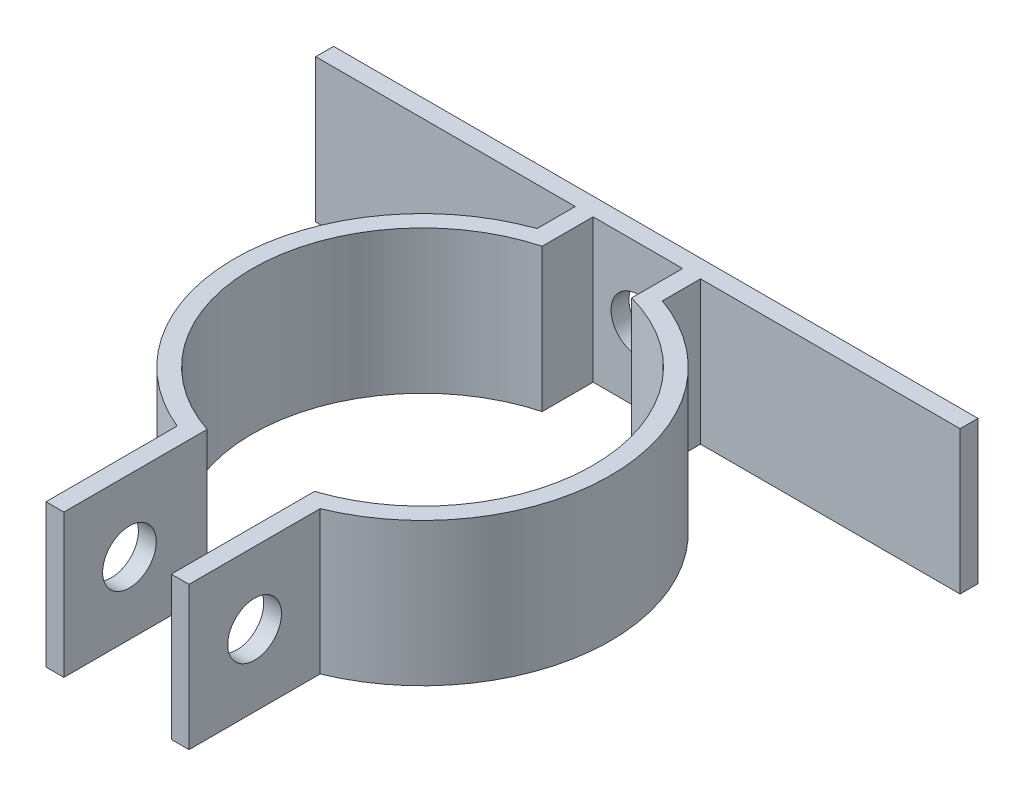
ISO-10303-21;
HEADER;
FILE_DESCRIPTION(('STEP AP214'),'2;1');
FILE_NAME('part.step','',(''),(''),'','','');
FILE_SCHEMA(('AUTOMOTIVE_DESIGN { 1 0 10303 214 1 1 1 1 }'));
ENDSEC;
DATA;
#1=APPLICATION_CONTEXT('core data for automotive mechanical design processes');
#2=APPLICATION_PROTOCOL_DEFINITION('international standard','automotive_design',2000,#1);
#3=PRODUCT_CONTEXT('',#1,'mechanical');
#4=PRODUCT('Part','Part','',(#3));
#5=PRODUCT_RELATED_PRODUCT_CATEGORY('part','',(#4));
#6=PRODUCT_DEFINITION_FORMATION('','',#4);
#7=PRODUCT_DEFINITION_CONTEXT('part definition',#1,'design');
#8=PRODUCT_DEFINITION('design','',#6,#7);
#9=PRODUCT_DEFINITION_SHAPE('','',#8);
#10=(LENGTH_UNIT() NAMED_UNIT(*) SI_UNIT(.MILLI.,.METRE.));
#11=(NAMED_UNIT(*) PLANE_ANGLE_UNIT() SI_UNIT($,.RADIAN.));
#12=(NAMED_UNIT(*) SI_UNIT($,.STERADIAN.) SOLID_ANGLE_UNIT());
#13=UNCERTAINTY_MEASURE_WITH_UNIT(LENGTH_MEASURE(1.E-05),#10,'distance_accuracy_value','');
#14=(GEOMETRIC_REPRESENTATION_CONTEXT(3) GLOBAL_UNCERTAINTY_ASSIGNED_CONTEXT((#13)) GLOBAL_UNIT_ASSIGNED_CONTEXT((#10,
#11,#12)) REPRESENTATION_CONTEXT('',''));
#15=CARTESIAN_POINT('',(0.,0.,0.));
#16=DIRECTION('',(0.,0.,1.));
#17=DIRECTION('',(1.,0.,0.));
#18=AXIS2_PLACEMENT_3D('',#15,#16,#17);
#19=CARTESIAN_POINT('',(0.,25.4,0.));
#20=DIRECTION('',(0.,0.,-1.));
#21=DIRECTION('',(-1.,0.,0.));
#22=AXIS2_PLACEMENT_3D('',#19,#20,#21);
#23=PLANE('',#22);
#24=DIRECTION('',(1.,0.,0.));
#25=VECTOR('',#24,1.);
#26=CARTESIAN_POINT('',(0.,0.,0.));
#27=LINE('',#26,#25);
#28=CARTESIAN_POINT('',(0.,0.,0.));
#29=VERTEX_POINT('',#28);
#30=CARTESIAN_POINT('',(46.0375,0.,0.));
#31=VERTEX_POINT('',#30);
#32=EDGE_CURVE('E201',#29,#31,#27,.T.);
#33=ORIENTED_EDGE('',*,*,#32,.T.);
#34=DIRECTION('',(0.,-1.,0.));
#35=VECTOR('',#34,1.);
#36=CARTESIAN_POINT('',(46.0375,25.4,0.));
#37=LINE('',#36,#35);
#38=CARTESIAN_POINT('',(46.0375,25.4,0.));
#39=VERTEX_POINT('',#38);
#40=EDGE_CURVE('E11',#39,#31,#37,.T.);
#41=ORIENTED_EDGE('',*,*,#40,.F.);
#42=DIRECTION('',(1.,0.,0.));
#43=VECTOR('',#42,1.);
#44=CARTESIAN_POINT('',(0.,25.4,0.));
#45=LINE('',#44,#43);
#46=CARTESIAN_POINT('',(0.,25.4,0.));
#47=VERTEX_POINT('',#46);
#48=EDGE_CURVE('E240',#47,#39,#45,.T.);
#49=ORIENTED_EDGE('',*,*,#48,.F.);
#50=DIRECTION('',(0.,-1.,0.));
#51=VECTOR('',#50,1.);
#52=CARTESIAN_POINT('',(0.,25.4,0.));
#53=LINE('',#52,#51);
#54=EDGE_CURVE('E197',#47,#29,#53,.T.);
#55=ORIENTED_EDGE('',*,*,#54,.T.);
#56=EDGE_LOOP('',(#33,#41,#49,#55));
#57=FACE_BOUND('',#56,.T.);
#58=ADVANCED_FACE('F33',(#57),#23,.F.);
#59=CARTESIAN_POINT('',(46.0375,25.4,6.77408824693363));
#60=DIRECTION('',(1.,0.,0.));
#61=DIRECTION('',(0.,0.,-1.));
#62=AXIS2_PLACEMENT_3D('',#59,#60,#61);
#63=PLANE('',#62);
#64=DIRECTION('',(0.,0.,1.));
#65=VECTOR('',#64,1.);
#66=CARTESIAN_POINT('',(46.0375,0.,6.77408824693363));
#67=LINE('',#66,#65);
#68=CARTESIAN_POINT('',(46.0375,0.,6.77408824693363));
#69=VERTEX_POINT('',#68);
#70=EDGE_CURVE('E204',#31,#69,#67,.T.);
#71=ORIENTED_EDGE('',*,*,#70,.T.);
#72=DIRECTION('',(0.,-1.,0.));
#73=VECTOR('',#72,1.);
#74=CARTESIAN_POINT('',(46.0375,25.4,6.77408824693363));
#75=LINE('',#74,#73);
#76=CARTESIAN_POINT('',(46.0375,25.4,6.77408824693363));
#77=VERTEX_POINT('',#76);
#78=EDGE_CURVE('E41',#77,#69,#75,.T.);
#79=ORIENTED_EDGE('',*,*,#78,.F.);
#80=DIRECTION('',(0.,0.,1.));
#81=VECTOR('',#80,1.);
#82=CARTESIAN_POINT('',(46.0375,25.4,6.77408824693363));
#83=LINE('',#82,#81);
#84=EDGE_CURVE('E128',#39,#77,#83,.T.);
#85=ORIENTED_EDGE('',*,*,#84,.F.);
#86=ORIENTED_EDGE('',*,*,#40,.T.);
#87=EDGE_LOOP('',(#71,#79,#85,#86));
#88=FACE_BOUND('',#87,.T.);
#89=ADVANCED_FACE('F359',(#88),#63,.F.);
#90=CARTESIAN_POINT('',(57.15,25.4,38.2049846706757));
#91=DIRECTION('',(0.,-1.,0.));
#92=DIRECTION('',(0.,0.,-1.));
#93=AXIS2_PLACEMENT_3D('',#90,#91,#92);
#94=CYLINDRICAL_SURFACE('',#93,33.3375);
#95=CARTESIAN_POINT('',(57.15,0.,38.2049846706757));
#96=DIRECTION('',(0.,1.,0.));
#97=DIRECTION('',(0.,0.,1.));
#98=AXIS2_PLACEMENT_3D('',#95,#96,#97);
#99=CIRCLE('',#98,33.3375);
#100=CARTESIAN_POINT('',(44.45,0.,69.028659115005));
#101=VERTEX_POINT('',#100);
#102=EDGE_CURVE('E207',#69,#101,#99,.T.);
#103=ORIENTED_EDGE('',*,*,#102,.T.);
#104=DIRECTION('',(0.,-1.,0.));
#105=VECTOR('',#104,1.);
#106=CARTESIAN_POINT('',(44.45,25.4,69.028659115005));
#107=LINE('',#106,#105);
#108=CARTESIAN_POINT('',(44.45,25.4,69.028659115005));
#109=VERTEX_POINT('',#108);
#110=EDGE_CURVE('E283',#109,#101,#107,.T.);
#111=ORIENTED_EDGE('',*,*,#110,.F.);
#112=CARTESIAN_POINT('',(57.15,25.4,38.2049846706757));
#113=DIRECTION('',(0.,1.,0.));
#114=DIRECTION('',(0.,0.,1.));
#115=AXIS2_PLACEMENT_3D('',#112,#113,#114);
#116=CIRCLE('',#115,33.3375);
#117=EDGE_CURVE('E291',#77,#109,#116,.T.);
#118=ORIENTED_EDGE('',*,*,#117,.F.);
#119=ORIENTED_EDGE('',*,*,#78,.T.);
#120=EDGE_LOOP('',(#103,#111,#118,#119));
#121=FACE_BOUND('',#120,.T.);
#122=ADVANCED_FACE('F289',(#121),#94,.T.);
#123=CARTESIAN_POINT('',(44.45,25.4,69.028659115005));
#124=DIRECTION('',(1.,0.,0.));
#125=DIRECTION('',(0.,0.,-1.));
#126=AXIS2_PLACEMENT_3D('',#123,#124,#125);
#127=PLANE('',#126);
#128=CARTESIAN_POINT('',(44.45,12.7,80.6650384614262));
#129=DIRECTION('',(1.,0.,0.));
#130=DIRECTION('',(0.,0.,-1.));
#131=AXIS2_PLACEMENT_3D('',#128,#129,#130);
#132=CIRCLE('',#131,4.7625);
#133=CARTESIAN_POINT('',(44.45,12.7,75.9025384614262));
#134=VERTEX_POINT('',#133);
#135=EDGE_CURVE('E205',#134,#134,#132,.T.);
#136=ORIENTED_EDGE('',*,*,#135,.T.);
#137=EDGE_LOOP('',(#136));
#138=FACE_BOUND('',#137,.T.);
#139=DIRECTION('',(0.,0.,1.));
#140=VECTOR('',#139,1.);
#141=CARTESIAN_POINT('',(44.45,0.,69.028659115005));
#142=LINE('',#141,#140);
#143=CARTESIAN_POINT('',(44.45,0.,92.2909647131982));
#144=VERTEX_POINT('',#143);
#145=EDGE_CURVE('E209',#101,#144,#142,.T.);
#146=ORIENTED_EDGE('',*,*,#145,.T.);
#147=DIRECTION('',(0.,-1.,0.));
#148=VECTOR('',#147,1.);
#149=CARTESIAN_POINT('',(44.45,25.4,92.2909647131982));
#150=LINE('',#149,#148);
#151=CARTESIAN_POINT('',(44.45,25.4,92.2909647131982));
#152=VERTEX_POINT('',#151);
#153=EDGE_CURVE('E280',#152,#144,#150,.T.);
#154=ORIENTED_EDGE('',*,*,#153,.F.);
#155=DIRECTION('',(0.,0.,1.));
#156=VECTOR('',#155,1.);
#157=CARTESIAN_POINT('',(44.45,25.4,69.028659115005));
#158=LINE('',#157,#156);
#159=EDGE_CURVE('E309',#109,#152,#158,.T.);
#160=ORIENTED_EDGE('',*,*,#159,.F.);
#161=ORIENTED_EDGE('',*,*,#110,.T.);
#162=EDGE_LOOP('',(#146,#154,#160,#161));
#163=FACE_BOUND('',#162,.T.);
#164=ADVANCED_FACE('F300',(#138,#163),#127,.F.);
#165=CARTESIAN_POINT('',(44.45,25.4,92.2909647131982));
#166=DIRECTION('',(0.,0.,-1.));
#167=DIRECTION('',(-1.,0.,0.));
#168=AXIS2_PLACEMENT_3D('',#165,#166,#167);
#169=PLANE('',#168);
#170=DIRECTION('',(1.,0.,0.));
#171=VECTOR('',#170,1.);
#172=CARTESIAN_POINT('',(44.45,0.,92.2909647131982));
#173=LINE('',#172,#171);
#174=CARTESIAN_POINT('',(47.625,0.,92.2909647131982));
#175=VERTEX_POINT('',#174);
#176=EDGE_CURVE('E211',#144,#175,#173,.T.);
#177=ORIENTED_EDGE('',*,*,#176,.T.);
#178=DIRECTION('',(0.,-1.,0.));
#179=VECTOR('',#178,1.);
#180=CARTESIAN_POINT('',(47.625,25.4,92.2909647131982));
#181=LINE('',#180,#179);
#182=CARTESIAN_POINT('',(47.625,25.4,92.2909647131982));
#183=VERTEX_POINT('',#182);
#184=EDGE_CURVE('E277',#183,#175,#181,.T.);
#185=ORIENTED_EDGE('',*,*,#184,.F.);
#186=DIRECTION('',(1.,0.,0.));
#187=VECTOR('',#186,1.);
#188=CARTESIAN_POINT('',(44.45,25.4,92.2909647131982));
#189=LINE('',#188,#187);
#190=EDGE_CURVE('E306',#152,#183,#189,.T.);
#191=ORIENTED_EDGE('',*,*,#190,.F.);
#192=ORIENTED_EDGE('',*,*,#153,.T.);
#193=EDGE_LOOP('',(#177,#185,#191,#192));
#194=FACE_BOUND('',#193,.T.);
#195=ADVANCED_FACE('F304',(#194),#169,.F.);
#196=CARTESIAN_POINT('',(47.625,25.4,66.8909647131982));
#197=DIRECTION('',(-1.,0.,0.));
#198=DIRECTION('',(0.,0.,1.));
#199=AXIS2_PLACEMENT_3D('',#196,#197,#198);
#200=PLANE('',#199);
#201=CARTESIAN_POINT('',(47.625,12.7,80.6650384614262));
#202=DIRECTION('',(-1.,0.,0.));
#203=DIRECTION('',(0.,0.,1.));
#204=AXIS2_PLACEMENT_3D('',#201,#202,#203);
#205=CIRCLE('',#204,4.7625);
#206=CARTESIAN_POINT('',(47.625,12.7,85.4275384614262));
#207=VERTEX_POINT('',#206);
#208=EDGE_CURVE('E581',#207,#207,#205,.T.);
#209=ORIENTED_EDGE('',*,*,#208,.T.);
#210=EDGE_LOOP('',(#209));
#211=FACE_BOUND('',#210,.T.);
#212=DIRECTION('',(0.,0.,-1.));
#213=VECTOR('',#212,1.);
#214=CARTESIAN_POINT('',(47.625,0.,66.8909647131982));
#215=LINE('',#214,#213);
#216=CARTESIAN_POINT('',(47.625,0.,66.8909647131982));
#217=VERTEX_POINT('',#216);
#218=EDGE_CURVE('E213',#175,#217,#215,.T.);
#219=ORIENTED_EDGE('',*,*,#218,.T.);
#220=DIRECTION('',(0.,-1.,0.));
#221=VECTOR('',#220,1.);
#222=CARTESIAN_POINT('',(47.625,25.4,66.8909647131982));
#223=LINE('',#222,#221);
#224=CARTESIAN_POINT('',(47.625,25.4,66.8909647131982));
#225=VERTEX_POINT('',#224);
#226=EDGE_CURVE('E274',#225,#217,#223,.T.);
#227=ORIENTED_EDGE('',*,*,#226,.F.);
#228=DIRECTION('',(0.,0.,-1.));
#229=VECTOR('',#228,1.);
#230=CARTESIAN_POINT('',(47.625,25.4,66.8909647131982));
#231=LINE('',#230,#229);
#232=EDGE_CURVE('E308',#183,#225,#231,.T.);
#233=ORIENTED_EDGE('',*,*,#232,.F.);
#234=ORIENTED_EDGE('',*,*,#184,.T.);
#235=EDGE_LOOP('',(#219,#227,#233,#234));
#236=FACE_BOUND('',#235,.T.);
#237=ADVANCED_FACE('F373',(#211,#236),#200,.F.);
#238=CARTESIAN_POINT('',(57.15,25.4,38.2049846706757));
#239=DIRECTION('',(0.,-1.,0.));
#240=DIRECTION('',(0.,0.,-1.));
#241=AXIS2_PLACEMENT_3D('',#238,#239,#240);
#242=CYLINDRICAL_SURFACE('',#241,30.226);
#243=CARTESIAN_POINT('',(57.15,0.,38.2049846706757));
#244=DIRECTION('',(0.,-1.,0.));
#245=DIRECTION('',(0.,0.,1.));
#246=AXIS2_PLACEMENT_3D('',#243,#244,#245);
#247=CIRCLE('',#246,30.226);
#248=CARTESIAN_POINT('',(49.2125,0.,9.03981418000307));
#249=VERTEX_POINT('',#248);
#250=EDGE_CURVE('E215',#217,#249,#247,.T.);
#251=ORIENTED_EDGE('',*,*,#250,.T.);
#252=DIRECTION('',(0.,-1.,0.));
#253=VECTOR('',#252,1.);
#254=CARTESIAN_POINT('',(49.2125,25.4,9.03981418000307));
#255=LINE('',#254,#253);
#256=CARTESIAN_POINT('',(49.2125,25.4,9.03981418000307));
#257=VERTEX_POINT('',#256);
#258=EDGE_CURVE('E271',#257,#249,#255,.T.);
#259=ORIENTED_EDGE('',*,*,#258,.F.);
#260=CARTESIAN_POINT('',(57.15,25.4,38.2049846706757));
#261=DIRECTION('',(0.,-1.,0.));
#262=DIRECTION('',(0.,0.,1.));
#263=AXIS2_PLACEMENT_3D('',#260,#261,#262);
#264=CIRCLE('',#263,30.226);
#265=EDGE_CURVE('E311',#225,#257,#264,.T.);
#266=ORIENTED_EDGE('',*,*,#265,.F.);
#267=ORIENTED_EDGE('',*,*,#226,.T.);
#268=EDGE_LOOP('',(#251,#259,#266,#267));
#269=FACE_BOUND('',#268,.T.);
#270=ADVANCED_FACE('F376',(#269),#242,.F.);
#271=CARTESIAN_POINT('',(49.2125,25.4,0.));
#272=DIRECTION('',(-1.,0.,0.));
#273=DIRECTION('',(0.,0.,1.));
#274=AXIS2_PLACEMENT_3D('',#271,#272,#273);
#275=PLANE('',#274);
#276=DIRECTION('',(0.,0.,-1.));
#277=VECTOR('',#276,1.);
#278=CARTESIAN_POINT('',(49.2125,0.,0.));
#279=LINE('',#278,#277);
#280=CARTESIAN_POINT('',(49.2125,0.,0.));
#281=VERTEX_POINT('',#280);
#282=EDGE_CURVE('E217',#249,#281,#279,.T.);
#283=ORIENTED_EDGE('',*,*,#282,.T.);
#284=DIRECTION('',(0.,-1.,0.));
#285=VECTOR('',#284,1.);
#286=CARTESIAN_POINT('',(49.2125,25.4,0.));
#287=LINE('',#286,#285);
#288=CARTESIAN_POINT('',(49.2125,25.4,0.));
#289=VERTEX_POINT('',#288);
#290=EDGE_CURVE('E268',#289,#281,#287,.T.);
#291=ORIENTED_EDGE('',*,*,#290,.F.);
#292=DIRECTION('',(0.,0.,-1.));
#293=VECTOR('',#292,1.);
#294=CARTESIAN_POINT('',(49.2125,25.4,0.));
#295=LINE('',#294,#293);
#296=EDGE_CURVE('E317',#257,#289,#295,.T.);
#297=ORIENTED_EDGE('',*,*,#296,.F.);
#298=ORIENTED_EDGE('',*,*,#258,.T.);
#299=EDGE_LOOP('',(#283,#291,#297,#298));
#300=FACE_BOUND('',#299,.T.);
#301=ADVANCED_FACE('F380',(#300),#275,.F.);
#302=CARTESIAN_POINT('',(49.2125,25.4,0.));
#303=DIRECTION('',(0.,0.,-1.));
#304=DIRECTION('',(-1.,0.,0.));
#305=AXIS2_PLACEMENT_3D('',#302,#303,#304);
#306=PLANE('',#305);
#307=CARTESIAN_POINT('',(57.15,12.7,0.));
#308=DIRECTION('',(0.,0.,-1.));
#309=DIRECTION('',(-1.,0.,0.));
#310=AXIS2_PLACEMENT_3D('',#307,#308,#309);
#311=CIRCLE('',#310,4.7625);
#312=CARTESIAN_POINT('',(52.3875,12.7,0.));
#313=VERTEX_POINT('',#312);
#314=EDGE_CURVE('E585',#313,#313,#311,.T.);
#315=ORIENTED_EDGE('',*,*,#314,.T.);
#316=EDGE_LOOP('',(#315));
#317=FACE_BOUND('',#316,.T.);
#318=DIRECTION('',(1.,0.,0.));
#319=VECTOR('',#318,1.);
#320=CARTESIAN_POINT('',(49.2125,0.,0.));
#321=LINE('',#320,#319);
#322=CARTESIAN_POINT('',(65.0875,0.,0.));
#323=VERTEX_POINT('',#322);
#324=EDGE_CURVE('E219',#281,#323,#321,.T.);
#325=ORIENTED_EDGE('',*,*,#324,.T.);
#326=DIRECTION('',(0.,-1.,0.));
#327=VECTOR('',#326,1.);
#328=CARTESIAN_POINT('',(65.0875,25.4,0.));
#329=LINE('',#328,#327);
#330=CARTESIAN_POINT('',(65.0875,25.4,0.));
#331=VERTEX_POINT('',#330);
#332=EDGE_CURVE('E265',#331,#323,#329,.T.);
#333=ORIENTED_EDGE('',*,*,#332,.F.);
#334=DIRECTION('',(1.,0.,0.));
#335=VECTOR('',#334,1.);
#336=CARTESIAN_POINT('',(49.2125,25.4,0.));
#337=LINE('',#336,#335);
#338=EDGE_CURVE('E319',#289,#331,#337,.T.);
#339=ORIENTED_EDGE('',*,*,#338,.F.);
#340=ORIENTED_EDGE('',*,*,#290,.T.);
#341=EDGE_LOOP('',(#325,#333,#339,#340));
#342=FACE_BOUND('',#341,.T.);
#343=ADVANCED_FACE('F384',(#317,#342),#306,.F.);
#344=CARTESIAN_POINT('',(65.0875,25.4,0.));
#345=DIRECTION('',(1.,0.,0.));
#346=DIRECTION('',(0.,0.,-1.));
#347=AXIS2_PLACEMENT_3D('',#344,#345,#346);
#348=PLANE('',#347);
#349=DIRECTION('',(0.,0.,1.));
#350=VECTOR('',#349,1.);
#351=CARTESIAN_POINT('',(65.0875,0.,0.));
#352=LINE('',#351,#350);
#353=CARTESIAN_POINT('',(65.0875,0.,9.03981418000306));
#354=VERTEX_POINT('',#353);
#355=EDGE_CURVE('E221',#323,#354,#352,.T.);
#356=ORIENTED_EDGE('',*,*,#355,.T.);
#357=DIRECTION('',(0.,-1.,0.));
#358=VECTOR('',#357,1.);
#359=CARTESIAN_POINT('',(65.0875,25.4,9.03981418000306));
#360=LINE('',#359,#358);
#361=CARTESIAN_POINT('',(65.0875,25.4,9.03981418000306));
#362=VERTEX_POINT('',#361);
#363=EDGE_CURVE('E262',#362,#354,#360,.T.);
#364=ORIENTED_EDGE('',*,*,#363,.F.);
#365=DIRECTION('',(0.,0.,1.));
#366=VECTOR('',#365,1.);
#367=CARTESIAN_POINT('',(65.0875,25.4,0.));
#368=LINE('',#367,#366);
#369=EDGE_CURVE('E321',#331,#362,#368,.T.);
#370=ORIENTED_EDGE('',*,*,#369,.F.);
#371=ORIENTED_EDGE('',*,*,#332,.T.);
#372=EDGE_LOOP('',(#356,#364,#370,#371));
#373=FACE_BOUND('',#372,.T.);
#374=ADVANCED_FACE('F388',(#373),#348,.F.);
#375=CARTESIAN_POINT('',(57.15,25.4,38.2049846706757));
#376=DIRECTION('',(0.,-1.,0.));
#377=DIRECTION('',(0.,0.,-1.));
#378=AXIS2_PLACEMENT_3D('',#375,#376,#377);
#379=CYLINDRICAL_SURFACE('',#378,30.226);
#380=CARTESIAN_POINT('',(57.15,0.,38.2049846706757));
#381=DIRECTION('',(0.,-1.,0.));
#382=DIRECTION('',(0.,0.,1.));
#383=AXIS2_PLACEMENT_3D('',#380,#381,#382);
#384=CIRCLE('',#383,30.226);
#385=CARTESIAN_POINT('',(66.675,0.,66.8909647131982));
#386=VERTEX_POINT('',#385);
#387=EDGE_CURVE('E223',#354,#386,#384,.T.);
#388=ORIENTED_EDGE('',*,*,#387,.T.);
#389=DIRECTION('',(0.,-1.,0.));
#390=VECTOR('',#389,1.);
#391=CARTESIAN_POINT('',(66.675,25.4,66.8909647131982));
#392=LINE('',#391,#390);
#393=CARTESIAN_POINT('',(66.675,25.4,66.8909647131982));
#394=VERTEX_POINT('',#393);
#395=EDGE_CURVE('E259',#394,#386,#392,.T.);
#396=ORIENTED_EDGE('',*,*,#395,.F.);
#397=CARTESIAN_POINT('',(57.15,25.4,38.2049846706757));
#398=DIRECTION('',(0.,-1.,0.));
#399=DIRECTION('',(0.,0.,1.));
#400=AXIS2_PLACEMENT_3D('',#397,#398,#399);
#401=CIRCLE('',#400,30.226);
#402=EDGE_CURVE('E323',#362,#394,#401,.T.);
#403=ORIENTED_EDGE('',*,*,#402,.F.);
#404=ORIENTED_EDGE('',*,*,#363,.T.);
#405=EDGE_LOOP('',(#388,#396,#403,#404));
#406=FACE_BOUND('',#405,.T.);
#407=ADVANCED_FACE('F392',(#406),#379,.F.);
#408=CARTESIAN_POINT('',(66.675,25.4,66.8909647131982));
#409=DIRECTION('',(1.,0.,0.));
#410=DIRECTION('',(0.,0.,-1.));
#411=AXIS2_PLACEMENT_3D('',#408,#409,#410);
#412=PLANE('',#411);
#413=CARTESIAN_POINT('',(66.675,12.7,80.6650384614262));
#414=DIRECTION('',(1.,0.,0.));
#415=DIRECTION('',(0.,0.,-1.));
#416=AXIS2_PLACEMENT_3D('',#413,#414,#415);
#417=CIRCLE('',#416,4.7625);
#418=CARTESIAN_POINT('',(66.675,12.7,75.9025384614262));
#419=VERTEX_POINT('',#418);
#420=EDGE_CURVE('E580',#419,#419,#417,.T.);
#421=ORIENTED_EDGE('',*,*,#420,.T.);
#422=EDGE_LOOP('',(#421));
#423=FACE_BOUND('',#422,.T.);
#424=DIRECTION('',(0.,0.,1.));
#425=VECTOR('',#424,1.);
#426=CARTESIAN_POINT('',(66.675,0.,66.8909647131982));
#427=LINE('',#426,#425);
#428=CARTESIAN_POINT('',(66.675,0.,92.2909647131982));
#429=VERTEX_POINT('',#428);
#430=EDGE_CURVE('E225',#386,#429,#427,.T.);
#431=ORIENTED_EDGE('',*,*,#430,.T.);
#432=DIRECTION('',(0.,-1.,0.));
#433=VECTOR('',#432,1.);
#434=CARTESIAN_POINT('',(66.675,25.4,92.2909647131982));
#435=LINE('',#434,#433);
#436=CARTESIAN_POINT('',(66.675,25.4,92.2909647131982));
#437=VERTEX_POINT('',#436);
#438=EDGE_CURVE('E256',#437,#429,#435,.T.);
#439=ORIENTED_EDGE('',*,*,#438,.F.);
#440=DIRECTION('',(0.,0.,1.));
#441=VECTOR('',#440,1.);
#442=CARTESIAN_POINT('',(66.675,25.4,66.8909647131982));
#443=LINE('',#442,#441);
#444=EDGE_CURVE('E325',#394,#437,#443,.T.);
#445=ORIENTED_EDGE('',*,*,#444,.F.);
#446=ORIENTED_EDGE('',*,*,#395,.T.);
#447=EDGE_LOOP('',(#431,#439,#445,#446));
#448=FACE_BOUND('',#447,.T.);
#449=ADVANCED_FACE('F396',(#423,#448),#412,.F.);
#450=CARTESIAN_POINT('',(69.8246,25.4,92.2909647131982));
#451=DIRECTION('',(0.,0.,-1.));
#452=DIRECTION('',(-1.,0.,0.));
#453=AXIS2_PLACEMENT_3D('',#450,#451,#452);
#454=PLANE('',#453);
#455=DIRECTION('',(1.,0.,0.));
#456=VECTOR('',#455,1.);
#457=CARTESIAN_POINT('',(69.8246,0.,92.2909647131982));
#458=LINE('',#457,#456);
#459=CARTESIAN_POINT('',(69.8246,0.,92.2909647131982));
#460=VERTEX_POINT('',#459);
#461=EDGE_CURVE('E227',#429,#460,#458,.T.);
#462=ORIENTED_EDGE('',*,*,#461,.T.);
#463=DIRECTION('',(0.,-1.,0.));
#464=VECTOR('',#463,1.);
#465=CARTESIAN_POINT('',(69.8246,25.4,92.2909647131982));
#466=LINE('',#465,#464);
#467=CARTESIAN_POINT('',(69.8246,25.4,92.2909647131982));
#468=VERTEX_POINT('',#467);
#469=EDGE_CURVE('E253',#468,#460,#466,.T.);
#470=ORIENTED_EDGE('',*,*,#469,.F.);
#471=DIRECTION('',(1.,0.,0.));
#472=VECTOR('',#471,1.);
#473=CARTESIAN_POINT('',(69.8246,25.4,92.2909647131982));
#474=LINE('',#473,#472);
#475=EDGE_CURVE('E327',#437,#468,#474,.T.);
#476=ORIENTED_EDGE('',*,*,#475,.F.);
#477=ORIENTED_EDGE('',*,*,#438,.T.);
#478=EDGE_LOOP('',(#462,#470,#476,#477));
#479=FACE_BOUND('',#478,.T.);
#480=ADVANCED_FACE('F400',(#479),#454,.F.);
#481=CARTESIAN_POINT('',(69.8246,25.4,69.0391122096543));
#482=DIRECTION('',(-1.,0.,0.));
#483=DIRECTION('',(0.,0.,1.));
#484=AXIS2_PLACEMENT_3D('',#481,#482,#483);
#485=PLANE('',#484);
#486=CARTESIAN_POINT('',(69.8246,12.7,80.6650384614262));
#487=DIRECTION('',(1.,0.,0.));
#488=DIRECTION('',(0.,0.,-1.));
#489=AXIS2_PLACEMENT_3D('',#486,#487,#488);
#490=CIRCLE('',#489,4.7625);
#491=CARTESIAN_POINT('',(69.8246,12.7,75.9025384614262));
#492=VERTEX_POINT('',#491);
#493=EDGE_CURVE('E577',#492,#492,#490,.T.);
#494=ORIENTED_EDGE('',*,*,#493,.F.);
#495=EDGE_LOOP('',(#494));
#496=FACE_BOUND('',#495,.T.);
#497=DIRECTION('',(0.,0.,-1.));
#498=VECTOR('',#497,1.);
#499=CARTESIAN_POINT('',(69.8246,0.,69.0391122096543));
#500=LINE('',#499,#498);
#501=CARTESIAN_POINT('',(69.8246,0.,69.0391122096543));
#502=VERTEX_POINT('',#501);
#503=EDGE_CURVE('E229',#460,#502,#500,.T.);
#504=ORIENTED_EDGE('',*,*,#503,.T.);
#505=DIRECTION('',(0.,-1.,0.));
#506=VECTOR('',#505,1.);
#507=CARTESIAN_POINT('',(69.8246,25.4,69.0391122096543));
#508=LINE('',#507,#506);
#509=CARTESIAN_POINT('',(69.8246,25.4,69.0391122096543));
#510=VERTEX_POINT('',#509);
#511=EDGE_CURVE('E250',#510,#502,#508,.T.);
#512=ORIENTED_EDGE('',*,*,#511,.F.);
#513=DIRECTION('',(0.,0.,-1.));
#514=VECTOR('',#513,1.);
#515=CARTESIAN_POINT('',(69.8246,25.4,69.0391122096543));
#516=LINE('',#515,#514);
#517=EDGE_CURVE('E329',#468,#510,#516,.T.);
#518=ORIENTED_EDGE('',*,*,#517,.F.);
#519=ORIENTED_EDGE('',*,*,#469,.T.);
#520=EDGE_LOOP('',(#504,#512,#518,#519));
#521=FACE_BOUND('',#520,.T.);
#522=ADVANCED_FACE('F404',(#496,#521),#485,.F.);
#523=CARTESIAN_POINT('',(57.15,25.4,38.2049846706757));
#524=DIRECTION('',(0.,-1.,0.));
#525=DIRECTION('',(0.,0.,-1.));
#526=AXIS2_PLACEMENT_3D('',#523,#524,#525);
#527=CYLINDRICAL_SURFACE('',#526,33.3375);
#528=CARTESIAN_POINT('',(57.15,0.,38.2049846706757));
#529=DIRECTION('',(0.,1.,0.));
#530=DIRECTION('',(0.,0.,1.));
#531=AXIS2_PLACEMENT_3D('',#528,#529,#530);
#532=CIRCLE('',#531,33.3375);
#533=CARTESIAN_POINT('',(68.2625,0.,6.77408824693361));
#534=VERTEX_POINT('',#533);
#535=EDGE_CURVE('E231',#502,#534,#532,.T.);
#536=ORIENTED_EDGE('',*,*,#535,.T.);
#537=DIRECTION('',(0.,-1.,0.));
#538=VECTOR('',#537,1.);
#539=CARTESIAN_POINT('',(68.2625,25.4,6.77408824693361));
#540=LINE('',#539,#538);
#541=CARTESIAN_POINT('',(68.2625,25.4,6.77408824693361));
#542=VERTEX_POINT('',#541);
#543=EDGE_CURVE('E247',#542,#534,#540,.T.);
#544=ORIENTED_EDGE('',*,*,#543,.F.);
#545=CARTESIAN_POINT('',(57.15,25.4,38.2049846706757));
#546=DIRECTION('',(0.,1.,0.));
#547=DIRECTION('',(0.,0.,1.));
#548=AXIS2_PLACEMENT_3D('',#545,#546,#547);
#549=CIRCLE('',#548,33.3375);
#550=EDGE_CURVE('E331',#510,#542,#549,.T.);
#551=ORIENTED_EDGE('',*,*,#550,.F.);
#552=ORIENTED_EDGE('',*,*,#511,.T.);
#553=EDGE_LOOP('',(#536,#544,#551,#552));
#554=FACE_BOUND('',#553,.T.);
#555=ADVANCED_FACE('F408',(#554),#527,.T.);
#556=CARTESIAN_POINT('',(68.2625,25.4,6.77408824693361));
#557=DIRECTION('',(-1.,0.,0.));
#558=DIRECTION('',(0.,0.,1.));
#559=AXIS2_PLACEMENT_3D('',#556,#557,#558);
#560=PLANE('',#559);
#561=DIRECTION('',(0.,0.,-1.));
#562=VECTOR('',#561,1.);
#563=CARTESIAN_POINT('',(68.2625,0.,6.77408824693361));
#564=LINE('',#563,#562);
#565=CARTESIAN_POINT('',(68.2625,0.,0.));
#566=VERTEX_POINT('',#565);
#567=EDGE_CURVE('E233',#534,#566,#564,.T.);
#568=ORIENTED_EDGE('',*,*,#567,.T.);
#569=DIRECTION('',(0.,-1.,0.));
#570=VECTOR('',#569,1.);
#571=CARTESIAN_POINT('',(68.2625,25.4,0.));
#572=LINE('',#571,#570);
#573=CARTESIAN_POINT('',(68.2625,25.4,0.));
#574=VERTEX_POINT('',#573);
#575=EDGE_CURVE('E244',#574,#566,#572,.T.);
#576=ORIENTED_EDGE('',*,*,#575,.F.);
#577=DIRECTION('',(0.,0.,-1.));
#578=VECTOR('',#577,1.);
#579=CARTESIAN_POINT('',(68.2625,25.4,6.77408824693361));
#580=LINE('',#579,#578);
#581=EDGE_CURVE('E333',#542,#574,#580,.T.);
#582=ORIENTED_EDGE('',*,*,#581,.F.);
#583=ORIENTED_EDGE('',*,*,#543,.T.);
#584=EDGE_LOOP('',(#568,#576,#582,#583));
#585=FACE_BOUND('',#584,.T.);
#586=ADVANCED_FACE('F339',(#585),#560,.F.);
#587=CARTESIAN_POINT('',(114.3,25.4,0.));
#588=DIRECTION('',(0.,0.,-1.));
#589=DIRECTION('',(-1.,0.,0.));
#590=AXIS2_PLACEMENT_3D('',#587,#588,#589);
#591=PLANE('',#590);
#592=DIRECTION('',(1.,0.,0.));
#593=VECTOR('',#592,1.);
#594=CARTESIAN_POINT('',(114.3,0.,0.));
#595=LINE('',#594,#593);
#596=CARTESIAN_POINT('',(114.3,0.,0.));
#597=VERTEX_POINT('',#596);
#598=EDGE_CURVE('E235',#566,#597,#595,.T.);
#599=ORIENTED_EDGE('',*,*,#598,.T.);
#600=DIRECTION('',(0.,-1.,0.));
#601=VECTOR('',#600,1.);
#602=CARTESIAN_POINT('',(114.3,25.4,0.));
#603=LINE('',#602,#601);
#604=CARTESIAN_POINT('',(114.3,25.4,0.));
#605=VERTEX_POINT('',#604);
#606=EDGE_CURVE('E192',#605,#597,#603,.T.);
#607=ORIENTED_EDGE('',*,*,#606,.F.);
#608=DIRECTION('',(1.,0.,0.));
#609=VECTOR('',#608,1.);
#610=CARTESIAN_POINT('',(114.3,25.4,0.));
#611=LINE('',#610,#609);
#612=EDGE_CURVE('E183',#574,#605,#611,.T.);
#613=ORIENTED_EDGE('',*,*,#612,.F.);
#614=ORIENTED_EDGE('',*,*,#575,.T.);
#615=EDGE_LOOP('',(#599,#607,#613,#614));
#616=FACE_BOUND('',#615,.T.);
#617=ADVANCED_FACE('F343',(#616),#591,.F.);
#618=CARTESIAN_POINT('',(114.3,25.4,-3.175));
#619=DIRECTION('',(-1.,0.,0.));
#620=DIRECTION('',(0.,0.,1.));
#621=AXIS2_PLACEMENT_3D('',#618,#619,#620);
#622=PLANE('',#621);
#623=DIRECTION('',(0.,0.,-1.));
#624=VECTOR('',#623,1.);
#625=CARTESIAN_POINT('',(114.3,0.,-3.175));
#626=LINE('',#625,#624);
#627=CARTESIAN_POINT('',(114.3,0.,-3.175));
#628=VERTEX_POINT('',#627);
#629=EDGE_CURVE('E191',#597,#628,#626,.T.);
#630=ORIENTED_EDGE('',*,*,#629,.T.);
#631=DIRECTION('',(0.,-1.,0.));
#632=VECTOR('',#631,1.);
#633=CARTESIAN_POINT('',(114.3,25.4,-3.175));
#634=LINE('',#633,#632);
#635=CARTESIAN_POINT('',(114.3,25.4,-3.175));
#636=VERTEX_POINT('',#635);
#637=EDGE_CURVE('E188',#636,#628,#634,.T.);
#638=ORIENTED_EDGE('',*,*,#637,.F.);
#639=DIRECTION('',(0.,0.,-1.));
#640=VECTOR('',#639,1.);
#641=CARTESIAN_POINT('',(114.3,25.4,-3.175));
#642=LINE('',#641,#640);
#643=EDGE_CURVE('E177',#605,#636,#642,.T.);
#644=ORIENTED_EDGE('',*,*,#643,.F.);
#645=ORIENTED_EDGE('',*,*,#606,.T.);
#646=EDGE_LOOP('',(#630,#638,#644,#645));
#647=FACE_BOUND('',#646,.T.);
#648=ADVANCED_FACE('F189',(#647),#622,.F.);
#649=CARTESIAN_POINT('',(0.,25.4,-3.175));
#650=DIRECTION('',(0.,0.,1.));
#651=DIRECTION('',(1.,0.,0.));
#652=AXIS2_PLACEMENT_3D('',#649,#650,#651);
#653=PLANE('',#652);
#654=CARTESIAN_POINT('',(57.15,12.7,-3.175));
#655=DIRECTION('',(0.,0.,-1.));
#656=DIRECTION('',(-1.,0.,0.));
#657=AXIS2_PLACEMENT_3D('',#654,#655,#656);
#658=CIRCLE('',#657,4.7625);
#659=CARTESIAN_POINT('',(52.3875,12.7,-3.175));
#660=VERTEX_POINT('',#659);
#661=EDGE_CURVE('E596',#660,#660,#658,.T.);
#662=ORIENTED_EDGE('',*,*,#661,.F.);
#663=EDGE_LOOP('',(#662));
#664=FACE_BOUND('',#663,.T.);
#665=DIRECTION('',(-1.,0.,0.));
#666=VECTOR('',#665,1.);
#667=CARTESIAN_POINT('',(0.,0.,-3.175));
#668=LINE('',#667,#666);
#669=CARTESIAN_POINT('',(0.,0.,-3.175));
#670=VERTEX_POINT('',#669);
#671=EDGE_CURVE('E114',#628,#670,#668,.T.);
#672=ORIENTED_EDGE('',*,*,#671,.T.);
#673=DIRECTION('',(0.,-1.,0.));
#674=VECTOR('',#673,1.);
#675=CARTESIAN_POINT('',(0.,25.4,-3.175));
#676=LINE('',#675,#674);
#677=CARTESIAN_POINT('',(0.,25.4,-3.175));
#678=VERTEX_POINT('',#677);
#679=EDGE_CURVE('E193',#678,#670,#676,.T.);
#680=ORIENTED_EDGE('',*,*,#679,.F.);
#681=DIRECTION('',(-1.,0.,0.));
#682=VECTOR('',#681,1.);
#683=CARTESIAN_POINT('',(0.,25.4,-3.175));
#684=LINE('',#683,#682);
#685=EDGE_CURVE('E181',#636,#678,#684,.T.);
#686=ORIENTED_EDGE('',*,*,#685,.F.);
#687=ORIENTED_EDGE('',*,*,#637,.T.);
#688=EDGE_LOOP('',(#672,#680,#686,#687));
#689=FACE_BOUND('',#688,.T.);
#690=ADVANCED_FACE('F195',(#664,#689),#653,.F.);
#691=CARTESIAN_POINT('',(0.,25.4,0.));
#692=DIRECTION('',(1.,0.,0.));
#693=DIRECTION('',(0.,0.,-1.));
#694=AXIS2_PLACEMENT_3D('',#691,#692,#693);
#695=PLANE('',#694);
#696=DIRECTION('',(0.,0.,1.));
#697=VECTOR('',#696,1.);
#698=CARTESIAN_POINT('',(0.,0.,0.));
#699=LINE('',#698,#697);
#700=EDGE_CURVE('E120',#670,#29,#699,.T.);
#701=ORIENTED_EDGE('',*,*,#700,.T.);
#702=ORIENTED_EDGE('',*,*,#54,.F.);
#703=DIRECTION('',(0.,0.,1.));
#704=VECTOR('',#703,1.);
#705=CARTESIAN_POINT('',(0.,25.4,0.));
#706=LINE('',#705,#704);
#707=EDGE_CURVE('E49',#678,#47,#706,.T.);
#708=ORIENTED_EDGE('',*,*,#707,.F.);
#709=ORIENTED_EDGE('',*,*,#679,.T.);
#710=EDGE_LOOP('',(#701,#702,#708,#709));
#711=FACE_BOUND('',#710,.T.);
#712=ADVANCED_FACE('F347',(#711),#695,.F.);
#713=CARTESIAN_POINT('',(57.15,25.4,38.2049846706757));
#714=DIRECTION('',(0.,1.,0.));
#715=DIRECTION('',(0.,0.,1.));
#716=AXIS2_PLACEMENT_3D('',#713,#714,#715);
#717=PLANE('',#716);
#718=ORIENTED_EDGE('',*,*,#48,.T.);
#719=ORIENTED_EDGE('',*,*,#84,.T.);
#720=ORIENTED_EDGE('',*,*,#117,.T.);
#721=ORIENTED_EDGE('',*,*,#159,.T.);
#722=ORIENTED_EDGE('',*,*,#190,.T.);
#723=ORIENTED_EDGE('',*,*,#232,.T.);
#724=ORIENTED_EDGE('',*,*,#265,.T.);
#725=ORIENTED_EDGE('',*,*,#296,.T.);
#726=ORIENTED_EDGE('',*,*,#338,.T.);
#727=ORIENTED_EDGE('',*,*,#369,.T.);
#728=ORIENTED_EDGE('',*,*,#402,.T.);
#729=ORIENTED_EDGE('',*,*,#444,.T.);
#730=ORIENTED_EDGE('',*,*,#475,.T.);
#731=ORIENTED_EDGE('',*,*,#517,.T.);
#732=ORIENTED_EDGE('',*,*,#550,.T.);
#733=ORIENTED_EDGE('',*,*,#581,.T.);
#734=ORIENTED_EDGE('',*,*,#612,.T.);
#735=ORIENTED_EDGE('',*,*,#643,.T.);
#736=ORIENTED_EDGE('',*,*,#685,.T.);
#737=ORIENTED_EDGE('',*,*,#707,.T.);
#738=EDGE_LOOP('',(#718,#719,#720,#721,#722,#723,#724,#725,#726,#727,#728,#729,#730,#731,#732,
#733,#734,#735,#736,#737));
#739=FACE_BOUND('',#738,.T.);
#740=ADVANCED_FACE('F179',(#739),#717,.T.);
#741=CARTESIAN_POINT('',(57.15,0.,38.2049846706757));
#742=DIRECTION('',(0.,1.,0.));
#743=DIRECTION('',(0.,0.,1.));
#744=AXIS2_PLACEMENT_3D('',#741,#742,#743);
#745=PLANE('',#744);
#746=ORIENTED_EDGE('',*,*,#32,.F.);
#747=ORIENTED_EDGE('',*,*,#700,.F.);
#748=ORIENTED_EDGE('',*,*,#671,.F.);
#749=ORIENTED_EDGE('',*,*,#629,.F.);
#750=ORIENTED_EDGE('',*,*,#598,.F.);
#751=ORIENTED_EDGE('',*,*,#567,.F.);
#752=ORIENTED_EDGE('',*,*,#535,.F.);
#753=ORIENTED_EDGE('',*,*,#503,.F.);
#754=ORIENTED_EDGE('',*,*,#461,.F.);
#755=ORIENTED_EDGE('',*,*,#430,.F.);
#756=ORIENTED_EDGE('',*,*,#387,.F.);
#757=ORIENTED_EDGE('',*,*,#355,.F.);
#758=ORIENTED_EDGE('',*,*,#324,.F.);
#759=ORIENTED_EDGE('',*,*,#282,.F.);
#760=ORIENTED_EDGE('',*,*,#250,.F.);
#761=ORIENTED_EDGE('',*,*,#218,.F.);
#762=ORIENTED_EDGE('',*,*,#176,.F.);
#763=ORIENTED_EDGE('',*,*,#145,.F.);
#764=ORIENTED_EDGE('',*,*,#102,.F.);
#765=ORIENTED_EDGE('',*,*,#70,.F.);
#766=EDGE_LOOP('',(#746,#747,#748,#749,#750,#751,#752,#753,#754,#755,#756,#757,#758,#759,#760,
#761,#762,#763,#764,#765));
#767=FACE_BOUND('',#766,.T.);
#768=ADVANCED_FACE('F295',(#767),#745,.F.);
#769=CARTESIAN_POINT('',(44.4246,12.7,80.6650384614262));
#770=DIRECTION('',(1.,0.,0.));
#771=DIRECTION('',(0.,0.,-1.));
#772=AXIS2_PLACEMENT_3D('',#769,#770,#771);
#773=CYLINDRICAL_SURFACE('',#772,4.7625);
#774=ORIENTED_EDGE('',*,*,#493,.T.);
#775=EDGE_LOOP('',(#774));
#776=FACE_BOUND('',#775,.T.);
#777=ORIENTED_EDGE('',*,*,#420,.F.);
#778=EDGE_LOOP('',(#777));
#779=FACE_BOUND('',#778,.T.);
#780=ADVANCED_FACE('F450',(#776,#779),#773,.F.);
#781=ORIENTED_EDGE('',*,*,#208,.F.);
#782=EDGE_LOOP('',(#781));
#783=FACE_BOUND('',#782,.T.);
#784=ORIENTED_EDGE('',*,*,#135,.F.);
#785=EDGE_LOOP('',(#784));
#786=FACE_BOUND('',#785,.T.);
#787=ADVANCED_FACE('F440',(#783,#786),#773,.F.);
#788=CARTESIAN_POINT('',(57.15,12.7,22.225));
#789=DIRECTION('',(0.,0.,-1.));
#790=DIRECTION('',(-1.,0.,0.));
#791=AXIS2_PLACEMENT_3D('',#788,#789,#790);
#792=CYLINDRICAL_SURFACE('',#791,4.7625);
#793=ORIENTED_EDGE('',*,*,#661,.T.);
#794=EDGE_LOOP('',(#793));
#795=FACE_BOUND('',#794,.T.);
#796=ORIENTED_EDGE('',*,*,#314,.F.);
#797=EDGE_LOOP('',(#796));
#798=FACE_BOUND('',#797,.T.);
#799=ADVANCED_FACE('F436',(#795,#798),#792,.F.);
#800=CLOSED_SHELL('',(#58,#89,#122,#164,#195,#237,#270,#301,#343,#374,#407,#449,#480,#522,#555,
#586,#617,#648,#690,#712,#740,#768,#780,#787,#799));
#801=MANIFOLD_SOLID_BREP('B2',#800);
#802=ADVANCED_BREP_SHAPE_REPRESENTATION('',(#18,#801),#14);
#803=SHAPE_DEFINITION_REPRESENTATION(#9,#802);
ENDSEC;
END-ISO-10303-21;
